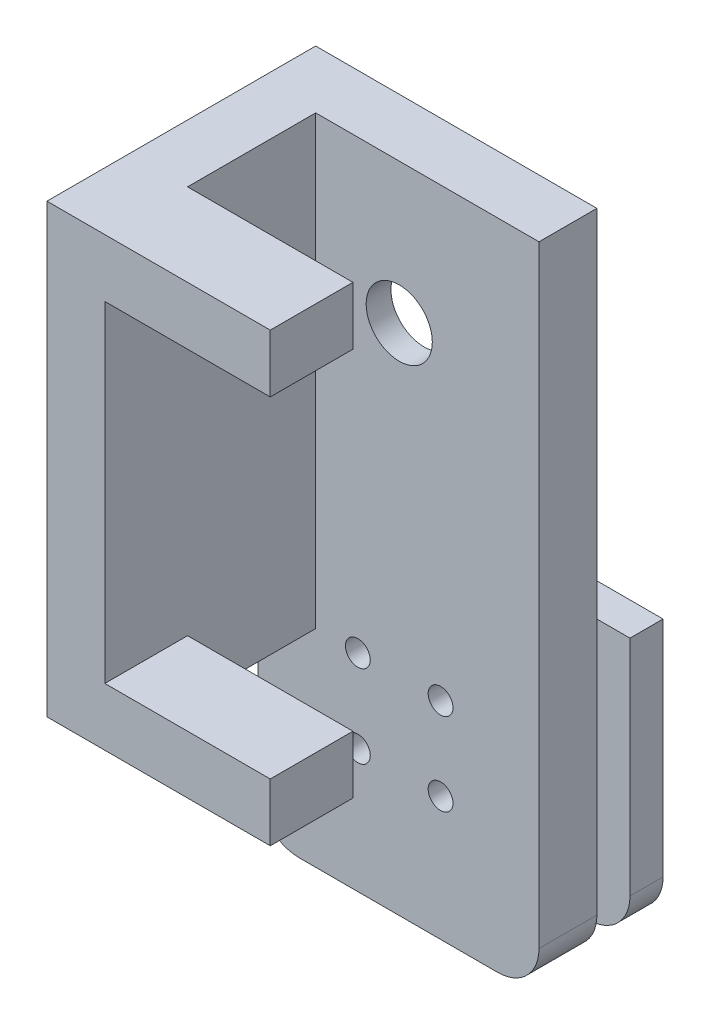
ISO-10303-21;
HEADER;
FILE_DESCRIPTION(('STEP AP214'),'2;1');
FILE_NAME('part.step','',(''),(''),'','','');
FILE_SCHEMA(('AUTOMOTIVE_DESIGN { 1 0 10303 214 1 1 1 1 }'));
ENDSEC;
DATA;
#1=APPLICATION_CONTEXT('core data for automotive mechanical design processes');
#2=APPLICATION_PROTOCOL_DEFINITION('international standard','automotive_design',2000,#1);
#3=PRODUCT_CONTEXT('',#1,'mechanical');
#4=PRODUCT('Part','Part','',(#3));
#5=PRODUCT_RELATED_PRODUCT_CATEGORY('part','',(#4));
#6=PRODUCT_DEFINITION_FORMATION('','',#4);
#7=PRODUCT_DEFINITION_CONTEXT('part definition',#1,'design');
#8=PRODUCT_DEFINITION('design','',#6,#7);
#9=PRODUCT_DEFINITION_SHAPE('','',#8);
#10=(LENGTH_UNIT() NAMED_UNIT(*) SI_UNIT(.MILLI.,.METRE.));
#11=(NAMED_UNIT(*) PLANE_ANGLE_UNIT() SI_UNIT($,.RADIAN.));
#12=(NAMED_UNIT(*) SI_UNIT($,.STERADIAN.) SOLID_ANGLE_UNIT());
#13=UNCERTAINTY_MEASURE_WITH_UNIT(LENGTH_MEASURE(1.E-05),#10,'distance_accuracy_value','');
#14=(GEOMETRIC_REPRESENTATION_CONTEXT(3) GLOBAL_UNCERTAINTY_ASSIGNED_CONTEXT((#13)) GLOBAL_UNIT_ASSIGNED_CONTEXT((#10,
#11,#12)) REPRESENTATION_CONTEXT('',''));
#15=CARTESIAN_POINT('',(0.,0.,0.));
#16=DIRECTION('',(0.,0.,1.));
#17=DIRECTION('',(1.,0.,0.));
#18=AXIS2_PLACEMENT_3D('',#15,#16,#17);
#19=CARTESIAN_POINT('',(0.,0.,10.));
#20=DIRECTION('',(0.,1.,0.));
#21=DIRECTION('',(0.,0.,1.));
#22=AXIS2_PLACEMENT_3D('',#19,#20,#21);
#23=PLANE('',#22);
#24=DIRECTION('',(-1.,0.,0.));
#25=VECTOR('',#24,1.);
#26=CARTESIAN_POINT('',(34.,0.,-15.494));
#27=LINE('',#26,#25);
#28=CARTESIAN_POINT('',(7.,0.,-15.494));
#29=VERTEX_POINT('',#28);
#30=CARTESIAN_POINT('',(0.,0.,-15.494));
#31=VERTEX_POINT('',#30);
#32=EDGE_CURVE('E236',#29,#31,#27,.T.);
#33=ORIENTED_EDGE('',*,*,#32,.F.);
#34=DIRECTION('',(0.,0.,1.));
#35=VECTOR('',#34,1.);
#36=CARTESIAN_POINT('',(7.,0.,-15.494));
#37=LINE('',#36,#35);
#38=CARTESIAN_POINT('',(7.,0.,0.));
#39=VERTEX_POINT('',#38);
#40=EDGE_CURVE('E284',#29,#39,#37,.T.);
#41=ORIENTED_EDGE('',*,*,#40,.T.);
#42=DIRECTION('',(1.,0.,0.));
#43=VECTOR('',#42,1.);
#44=CARTESIAN_POINT('',(0.,0.,0.));
#45=LINE('',#44,#43);
#46=CARTESIAN_POINT('',(27.,0.,0.));
#47=VERTEX_POINT('',#46);
#48=EDGE_CURVE('E295',#39,#47,#45,.T.);
#49=ORIENTED_EDGE('',*,*,#48,.T.);
#50=DIRECTION('',(0.,0.,-1.));
#51=VECTOR('',#50,1.);
#52=CARTESIAN_POINT('',(27.,0.,10.));
#53=LINE('',#52,#51);
#54=CARTESIAN_POINT('',(27.,0.,10.));
#55=VERTEX_POINT('',#54);
#56=EDGE_CURVE('E362',#55,#47,#53,.T.);
#57=ORIENTED_EDGE('',*,*,#56,.F.);
#58=DIRECTION('',(1.,0.,0.));
#59=VECTOR('',#58,1.);
#60=CARTESIAN_POINT('',(0.,0.,10.));
#61=LINE('',#60,#59);
#62=CARTESIAN_POINT('',(0.,0.,10.));
#63=VERTEX_POINT('',#62);
#64=EDGE_CURVE('E300',#63,#55,#61,.T.);
#65=ORIENTED_EDGE('',*,*,#64,.F.);
#66=DIRECTION('',(0.,0.,-1.));
#67=VECTOR('',#66,1.);
#68=CARTESIAN_POINT('',(0.,0.,10.));
#69=LINE('',#68,#67);
#70=EDGE_CURVE('E366',#63,#31,#69,.T.);
#71=ORIENTED_EDGE('',*,*,#70,.T.);
#72=EDGE_LOOP('',(#33,#41,#49,#57,#65,#71));
#73=FACE_BOUND('',#72,.T.);
#74=ADVANCED_FACE('F38',(#73),#23,.F.);
#75=CARTESIAN_POINT('',(0.,0.,0.));
#76=DIRECTION('',(0.,0.,-1.));
#77=DIRECTION('',(-1.,0.,0.));
#78=AXIS2_PLACEMENT_3D('',#75,#76,#77);
#79=PLANE('',#78);
#80=DIRECTION('',(0.,-1.,0.));
#81=VECTOR('',#80,1.);
#82=CARTESIAN_POINT('',(7.,0.,0.));
#83=LINE('',#82,#81);
#84=CARTESIAN_POINT('',(7.,54.,0.));
#85=VERTEX_POINT('',#84);
#86=CARTESIAN_POINT('',(6.99999999999999,47.,0.));
#87=VERTEX_POINT('',#86);
#88=EDGE_CURVE('E276',#85,#87,#83,.T.);
#89=ORIENTED_EDGE('',*,*,#88,.F.);
#90=DIRECTION('',(-1.,0.,0.));
#91=VECTOR('',#90,1.);
#92=CARTESIAN_POINT('',(0.,54.,0.));
#93=LINE('',#92,#91);
#94=CARTESIAN_POINT('',(27.,54.,0.));
#95=VERTEX_POINT('',#94);
#96=EDGE_CURVE('E301',#95,#85,#93,.T.);
#97=ORIENTED_EDGE('',*,*,#96,.F.);
#98=DIRECTION('',(0.,1.,0.));
#99=VECTOR('',#98,1.);
#100=CARTESIAN_POINT('',(27.,54.,0.));
#101=LINE('',#100,#99);
#102=CARTESIAN_POINT('',(27.,47.,0.));
#103=VERTEX_POINT('',#102);
#104=EDGE_CURVE('E335',#103,#95,#101,.T.);
#105=ORIENTED_EDGE('',*,*,#104,.F.);
#106=DIRECTION('',(1.,0.,0.));
#107=VECTOR('',#106,1.);
#108=CARTESIAN_POINT('',(27.,47.,0.));
#109=LINE('',#108,#107);
#110=EDGE_CURVE('E332',#87,#103,#109,.T.);
#111=ORIENTED_EDGE('',*,*,#110,.F.);
#112=EDGE_LOOP('',(#89,#97,#105,#111));
#113=FACE_BOUND('',#112,.T.);
#114=ADVANCED_FACE('F554',(#113),#79,.T.);
#115=CARTESIAN_POINT('',(0.,0.,10.));
#116=DIRECTION('',(1.,0.,0.));
#117=DIRECTION('',(0.,0.,-1.));
#118=AXIS2_PLACEMENT_3D('',#115,#116,#117);
#119=PLANE('',#118);
#120=DIRECTION('',(0.,-1.,0.));
#121=VECTOR('',#120,1.);
#122=CARTESIAN_POINT('',(0.,41.928498393146,-30.494));
#123=LINE('',#122,#121);
#124=CARTESIAN_POINT('',(0.,6.99999999999999,-30.494));
#125=VERTEX_POINT('',#124);
#126=CARTESIAN_POINT('',(0.,-20.,-30.494));
#127=VERTEX_POINT('',#126);
#128=EDGE_CURVE('E217',#125,#127,#123,.T.);
#129=ORIENTED_EDGE('',*,*,#128,.T.);
#130=DIRECTION('',(0.,0.,-1.));
#131=VECTOR('',#130,1.);
#132=CARTESIAN_POINT('',(0.,-20.,-15.494));
#133=LINE('',#132,#131);
#134=CARTESIAN_POINT('',(0.,-20.,-15.494));
#135=VERTEX_POINT('',#134);
#136=EDGE_CURVE('E47',#127,#135,#133,.F.);
#137=ORIENTED_EDGE('',*,*,#136,.T.);
#138=DIRECTION('',(0.,1.,0.));
#139=VECTOR('',#138,1.);
#140=CARTESIAN_POINT('',(0.,-25.,-15.494));
#141=LINE('',#140,#139);
#142=EDGE_CURVE('E235',#135,#31,#141,.T.);
#143=ORIENTED_EDGE('',*,*,#142,.T.);
#144=ORIENTED_EDGE('',*,*,#70,.F.);
#145=DIRECTION('',(0.,-1.,0.));
#146=VECTOR('',#145,1.);
#147=CARTESIAN_POINT('',(0.,0.,10.));
#148=LINE('',#147,#146);
#149=CARTESIAN_POINT('',(0.,54.,10.));
#150=VERTEX_POINT('',#149);
#151=EDGE_CURVE('E296',#150,#63,#148,.T.);
#152=ORIENTED_EDGE('',*,*,#151,.F.);
#153=DIRECTION('',(0.,0.,-1.));
#154=VECTOR('',#153,1.);
#155=CARTESIAN_POINT('',(0.,54.,10.));
#156=LINE('',#155,#154);
#157=CARTESIAN_POINT('',(0.,54.,-22.494));
#158=VERTEX_POINT('',#157);
#159=EDGE_CURVE('E322',#150,#158,#156,.T.);
#160=ORIENTED_EDGE('',*,*,#159,.T.);
#161=DIRECTION('',(0.,-1.,0.));
#162=VECTOR('',#161,1.);
#163=CARTESIAN_POINT('',(0.,54.,-22.494));
#164=LINE('',#163,#162);
#165=CARTESIAN_POINT('',(0.,6.99999999999999,-22.494));
#166=VERTEX_POINT('',#165);
#167=EDGE_CURVE('E252',#158,#166,#164,.T.);
#168=ORIENTED_EDGE('',*,*,#167,.T.);
#169=DIRECTION('',(0.,0.,1.));
#170=VECTOR('',#169,1.);
#171=CARTESIAN_POINT('',(0.,6.99999999999999,-22.494));
#172=LINE('',#171,#170);
#173=EDGE_CURVE('E426',#125,#166,#172,.T.);
#174=ORIENTED_EDGE('',*,*,#173,.F.);
#175=EDGE_LOOP('',(#129,#137,#143,#144,#152,#160,#168,#174));
#176=FACE_BOUND('',#175,.T.);
#177=ADVANCED_FACE('F515',(#176),#119,.F.);
#178=CARTESIAN_POINT('',(27.,0.,10.));
#179=DIRECTION('',(-1.,0.,0.));
#180=DIRECTION('',(0.,-1.,0.));
#181=AXIS2_PLACEMENT_3D('',#178,#179,#180);
#182=PLANE('',#181);
#183=DIRECTION('',(0.,1.,0.));
#184=VECTOR('',#183,1.);
#185=CARTESIAN_POINT('',(27.,0.,0.));
#186=LINE('',#185,#184);
#187=CARTESIAN_POINT('',(27.,7.,0.));
#188=VERTEX_POINT('',#187);
#189=EDGE_CURVE('E325',#47,#188,#186,.T.);
#190=ORIENTED_EDGE('',*,*,#189,.T.);
#191=DIRECTION('',(0.,0.,-1.));
#192=VECTOR('',#191,1.);
#193=CARTESIAN_POINT('',(27.,7.,10.));
#194=LINE('',#193,#192);
#195=CARTESIAN_POINT('',(27.,7.,10.));
#196=VERTEX_POINT('',#195);
#197=EDGE_CURVE('E358',#196,#188,#194,.T.);
#198=ORIENTED_EDGE('',*,*,#197,.F.);
#199=DIRECTION('',(0.,1.,0.));
#200=VECTOR('',#199,1.);
#201=CARTESIAN_POINT('',(27.,0.,10.));
#202=LINE('',#201,#200);
#203=EDGE_CURVE('E304',#55,#196,#202,.T.);
#204=ORIENTED_EDGE('',*,*,#203,.F.);
#205=ORIENTED_EDGE('',*,*,#56,.T.);
#206=EDGE_LOOP('',(#190,#198,#204,#205));
#207=FACE_BOUND('',#206,.T.);
#208=ADVANCED_FACE('F573',(#207),#182,.F.);
#209=CARTESIAN_POINT('',(27.,7.,10.));
#210=DIRECTION('',(0.,-1.,0.));
#211=DIRECTION('',(1.,0.,0.));
#212=AXIS2_PLACEMENT_3D('',#209,#210,#211);
#213=PLANE('',#212);
#214=DIRECTION('',(-1.,0.,0.));
#215=VECTOR('',#214,1.);
#216=CARTESIAN_POINT('',(27.,7.,0.));
#217=LINE('',#216,#215);
#218=CARTESIAN_POINT('',(7.,6.99999999999999,0.));
#219=VERTEX_POINT('',#218);
#220=EDGE_CURVE('E328',#188,#219,#217,.T.);
#221=ORIENTED_EDGE('',*,*,#220,.T.);
#222=DIRECTION('',(0.,0.,-1.));
#223=VECTOR('',#222,1.);
#224=CARTESIAN_POINT('',(7.,6.99999999999999,10.));
#225=LINE('',#224,#223);
#226=CARTESIAN_POINT('',(7.,6.99999999999999,10.));
#227=VERTEX_POINT('',#226);
#228=EDGE_CURVE('E354',#227,#219,#225,.T.);
#229=ORIENTED_EDGE('',*,*,#228,.F.);
#230=DIRECTION('',(-1.,0.,0.));
#231=VECTOR('',#230,1.);
#232=CARTESIAN_POINT('',(27.,7.,10.));
#233=LINE('',#232,#231);
#234=EDGE_CURVE('E307',#196,#227,#233,.T.);
#235=ORIENTED_EDGE('',*,*,#234,.F.);
#236=ORIENTED_EDGE('',*,*,#197,.T.);
#237=EDGE_LOOP('',(#221,#229,#235,#236));
#238=FACE_BOUND('',#237,.T.);
#239=ADVANCED_FACE('F567',(#238),#213,.F.);
#240=CARTESIAN_POINT('',(7.,6.99999999999999,10.));
#241=DIRECTION('',(-1.,0.,0.));
#242=DIRECTION('',(0.,-1.,0.));
#243=AXIS2_PLACEMENT_3D('',#240,#241,#242);
#244=PLANE('',#243);
#245=ORIENTED_EDGE('',*,*,#228,.T.);
#246=EDGE_CURVE('E240',#219,#39,#83,.T.);
#247=ORIENTED_EDGE('',*,*,#246,.T.);
#248=ORIENTED_EDGE('',*,*,#40,.F.);
#249=DIRECTION('',(0.,-1.,0.));
#250=VECTOR('',#249,1.);
#251=CARTESIAN_POINT('',(7.,0.,-15.494));
#252=LINE('',#251,#250);
#253=CARTESIAN_POINT('',(7.,54.,-15.494));
#254=VERTEX_POINT('',#253);
#255=EDGE_CURVE('E280',#254,#29,#252,.T.);
#256=ORIENTED_EDGE('',*,*,#255,.F.);
#257=DIRECTION('',(0.,0.,1.));
#258=VECTOR('',#257,1.);
#259=CARTESIAN_POINT('',(7.,54.,-15.494));
#260=LINE('',#259,#258);
#261=EDGE_CURVE('E291',#254,#85,#260,.T.);
#262=ORIENTED_EDGE('',*,*,#261,.T.);
#263=ORIENTED_EDGE('',*,*,#88,.T.);
#264=DIRECTION('',(0.,0.,-1.));
#265=VECTOR('',#264,1.);
#266=CARTESIAN_POINT('',(6.99999999999999,47.,10.));
#267=LINE('',#266,#265);
#268=CARTESIAN_POINT('',(6.99999999999999,47.,10.));
#269=VERTEX_POINT('',#268);
#270=EDGE_CURVE('E351',#269,#87,#267,.T.);
#271=ORIENTED_EDGE('',*,*,#270,.F.);
#272=DIRECTION('',(0.,1.,0.));
#273=VECTOR('',#272,1.);
#274=CARTESIAN_POINT('',(7.,6.99999999999999,10.));
#275=LINE('',#274,#273);
#276=EDGE_CURVE('E310',#227,#269,#275,.T.);
#277=ORIENTED_EDGE('',*,*,#276,.F.);
#278=EDGE_LOOP('',(#245,#247,#248,#256,#262,#263,#271,#277));
#279=FACE_BOUND('',#278,.T.);
#280=ADVANCED_FACE('F540',(#279),#244,.F.);
#281=CARTESIAN_POINT('',(27.,47.,10.));
#282=DIRECTION('',(0.,1.,0.));
#283=DIRECTION('',(0.,0.,1.));
#284=AXIS2_PLACEMENT_3D('',#281,#282,#283);
#285=PLANE('',#284);
#286=ORIENTED_EDGE('',*,*,#110,.T.);
#287=DIRECTION('',(0.,0.,-1.));
#288=VECTOR('',#287,1.);
#289=CARTESIAN_POINT('',(27.,47.,10.));
#290=LINE('',#289,#288);
#291=CARTESIAN_POINT('',(27.,47.,10.));
#292=VERTEX_POINT('',#291);
#293=EDGE_CURVE('E347',#292,#103,#290,.T.);
#294=ORIENTED_EDGE('',*,*,#293,.F.);
#295=DIRECTION('',(1.,0.,0.));
#296=VECTOR('',#295,1.);
#297=CARTESIAN_POINT('',(27.,47.,10.));
#298=LINE('',#297,#296);
#299=EDGE_CURVE('E313',#269,#292,#298,.T.);
#300=ORIENTED_EDGE('',*,*,#299,.F.);
#301=ORIENTED_EDGE('',*,*,#270,.T.);
#302=EDGE_LOOP('',(#286,#294,#300,#301));
#303=FACE_BOUND('',#302,.T.);
#304=ADVANCED_FACE('F561',(#303),#285,.F.);
#305=CARTESIAN_POINT('',(27.,54.,10.));
#306=DIRECTION('',(-1.,0.,0.));
#307=DIRECTION('',(0.,-1.,0.));
#308=AXIS2_PLACEMENT_3D('',#305,#306,#307);
#309=PLANE('',#308);
#310=ORIENTED_EDGE('',*,*,#104,.T.);
#311=DIRECTION('',(0.,0.,-1.));
#312=VECTOR('',#311,1.);
#313=CARTESIAN_POINT('',(27.,54.,10.));
#314=LINE('',#313,#312);
#315=CARTESIAN_POINT('',(27.,54.,10.));
#316=VERTEX_POINT('',#315);
#317=EDGE_CURVE('E343',#316,#95,#314,.T.);
#318=ORIENTED_EDGE('',*,*,#317,.F.);
#319=DIRECTION('',(0.,1.,0.));
#320=VECTOR('',#319,1.);
#321=CARTESIAN_POINT('',(27.,54.,10.));
#322=LINE('',#321,#320);
#323=EDGE_CURVE('E316',#292,#316,#322,.T.);
#324=ORIENTED_EDGE('',*,*,#323,.F.);
#325=ORIENTED_EDGE('',*,*,#293,.T.);
#326=EDGE_LOOP('',(#310,#318,#324,#325));
#327=FACE_BOUND('',#326,.T.);
#328=ADVANCED_FACE('F813',(#327),#309,.F.);
#329=CARTESIAN_POINT('',(0.,54.,10.));
#330=DIRECTION('',(0.,-1.,0.));
#331=DIRECTION('',(1.,0.,0.));
#332=AXIS2_PLACEMENT_3D('',#329,#330,#331);
#333=PLANE('',#332);
#334=ORIENTED_EDGE('',*,*,#96,.T.);
#335=ORIENTED_EDGE('',*,*,#261,.F.);
#336=DIRECTION('',(-1.,0.,0.));
#337=VECTOR('',#336,1.);
#338=CARTESIAN_POINT('',(34.,54.,-15.494));
#339=LINE('',#338,#337);
#340=CARTESIAN_POINT('',(34.,54.,-15.494));
#341=VERTEX_POINT('',#340);
#342=EDGE_CURVE('E268',#341,#254,#339,.T.);
#343=ORIENTED_EDGE('',*,*,#342,.F.);
#344=DIRECTION('',(0.,0.,-1.));
#345=VECTOR('',#344,1.);
#346=CARTESIAN_POINT('',(34.,54.,-15.494));
#347=LINE('',#346,#345);
#348=CARTESIAN_POINT('',(34.,54.,-22.494));
#349=VERTEX_POINT('',#348);
#350=EDGE_CURVE('E264',#341,#349,#347,.T.);
#351=ORIENTED_EDGE('',*,*,#350,.T.);
#352=DIRECTION('',(-1.,0.,0.));
#353=VECTOR('',#352,1.);
#354=CARTESIAN_POINT('',(34.,54.,-22.494));
#355=LINE('',#354,#353);
#356=EDGE_CURVE('E272',#349,#158,#355,.T.);
#357=ORIENTED_EDGE('',*,*,#356,.T.);
#358=ORIENTED_EDGE('',*,*,#159,.F.);
#359=DIRECTION('',(-1.,0.,0.));
#360=VECTOR('',#359,1.);
#361=CARTESIAN_POINT('',(0.,54.,10.));
#362=LINE('',#361,#360);
#363=EDGE_CURVE('E319',#316,#150,#362,.T.);
#364=ORIENTED_EDGE('',*,*,#363,.F.);
#365=ORIENTED_EDGE('',*,*,#317,.T.);
#366=EDGE_LOOP('',(#334,#335,#343,#351,#357,#358,#364,#365));
#367=FACE_BOUND('',#366,.T.);
#368=ADVANCED_FACE('F534',(#367),#333,.F.);
#369=CARTESIAN_POINT('',(0.,0.,10.));
#370=DIRECTION('',(0.,0.,-1.));
#371=DIRECTION('',(-1.,0.,0.));
#372=AXIS2_PLACEMENT_3D('',#369,#370,#371);
#373=PLANE('',#372);
#374=ORIENTED_EDGE('',*,*,#151,.T.);
#375=ORIENTED_EDGE('',*,*,#64,.T.);
#376=ORIENTED_EDGE('',*,*,#203,.T.);
#377=ORIENTED_EDGE('',*,*,#234,.T.);
#378=ORIENTED_EDGE('',*,*,#276,.T.);
#379=ORIENTED_EDGE('',*,*,#299,.T.);
#380=ORIENTED_EDGE('',*,*,#323,.T.);
#381=ORIENTED_EDGE('',*,*,#363,.T.);
#382=EDGE_LOOP('',(#374,#375,#376,#377,#378,#379,#380,#381));
#383=FACE_BOUND('',#382,.T.);
#384=ADVANCED_FACE('F546',(#383),#373,.F.);
#385=ORIENTED_EDGE('',*,*,#246,.F.);
#386=ORIENTED_EDGE('',*,*,#220,.F.);
#387=ORIENTED_EDGE('',*,*,#189,.F.);
#388=ORIENTED_EDGE('',*,*,#48,.F.);
#389=EDGE_LOOP('',(#385,#386,#387,#388));
#390=FACE_BOUND('',#389,.T.);
#391=ADVANCED_FACE('F571',(#390),#79,.T.);
#392=CARTESIAN_POINT('',(34.,54.,-22.494));
#393=DIRECTION('',(0.,0.,-1.));
#394=DIRECTION('',(0.,1.,0.));
#395=AXIS2_PLACEMENT_3D('',#392,#393,#394);
#396=PLANE('',#395);
#397=CARTESIAN_POINT('',(22.1,-10.,-22.494));
#398=DIRECTION('',(0.,0.,-1.));
#399=DIRECTION('',(0.,1.,0.));
#400=AXIS2_PLACEMENT_3D('',#397,#398,#399);
#401=CIRCLE('',#400,1.49999999999999);
#402=CARTESIAN_POINT('',(22.1,-8.50000000000001,-22.494));
#403=VERTEX_POINT('',#402);
#404=EDGE_CURVE('E389',#403,#403,#401,.T.);
#405=ORIENTED_EDGE('',*,*,#404,.F.);
#406=EDGE_LOOP('',(#405));
#407=FACE_BOUND('',#406,.T.);
#408=CARTESIAN_POINT('',(22.1,0.,-22.494));
#409=DIRECTION('',(0.,0.,-1.));
#410=DIRECTION('',(0.,1.,0.));
#411=AXIS2_PLACEMENT_3D('',#408,#409,#410);
#412=CIRCLE('',#411,1.49999999999999);
#413=CARTESIAN_POINT('',(22.1,1.49999999999999,-22.494));
#414=VERTEX_POINT('',#413);
#415=EDGE_CURVE('E379',#414,#414,#412,.T.);
#416=ORIENTED_EDGE('',*,*,#415,.F.);
#417=EDGE_LOOP('',(#416));
#418=FACE_BOUND('',#417,.T.);
#419=CARTESIAN_POINT('',(12.1,0.,-22.494));
#420=DIRECTION('',(0.,0.,-1.));
#421=DIRECTION('',(0.,1.,0.));
#422=AXIS2_PLACEMENT_3D('',#419,#420,#421);
#423=CIRCLE('',#422,1.49999999999999);
#424=CARTESIAN_POINT('',(12.1,1.49999999999999,-22.494));
#425=VERTEX_POINT('',#424);
#426=EDGE_CURVE('E462',#425,#425,#423,.T.);
#427=ORIENTED_EDGE('',*,*,#426,.F.);
#428=EDGE_LOOP('',(#427));
#429=FACE_BOUND('',#428,.T.);
#430=CARTESIAN_POINT('',(12.1,-10.,-22.494));
#431=DIRECTION('',(0.,0.,-1.));
#432=DIRECTION('',(0.,1.,0.));
#433=AXIS2_PLACEMENT_3D('',#430,#431,#432);
#434=CIRCLE('',#433,1.49999999999999);
#435=CARTESIAN_POINT('',(12.1,-8.50000000000001,-22.494));
#436=VERTEX_POINT('',#435);
#437=EDGE_CURVE('E451',#436,#436,#434,.T.);
#438=ORIENTED_EDGE('',*,*,#437,.F.);
#439=EDGE_LOOP('',(#438));
#440=FACE_BOUND('',#439,.T.);
#441=DIRECTION('',(0.,-1.,0.));
#442=VECTOR('',#441,1.);
#443=CARTESIAN_POINT('',(34.,54.,-22.494));
#444=LINE('',#443,#442);
#445=CARTESIAN_POINT('',(34.,-20.,-22.494));
#446=VERTEX_POINT('',#445);
#447=EDGE_CURVE('E257',#349,#446,#444,.T.);
#448=ORIENTED_EDGE('',*,*,#447,.T.);
#449=CARTESIAN_POINT('',(29.,-20.,-22.494));
#450=DIRECTION('',(0.,0.,-1.));
#451=DIRECTION('',(0.,1.,0.));
#452=AXIS2_PLACEMENT_3D('',#449,#450,#451);
#453=CIRCLE('',#452,5.);
#454=CARTESIAN_POINT('',(29.,-25.,-22.494));
#455=VERTEX_POINT('',#454);
#456=EDGE_CURVE('E403',#446,#455,#453,.T.);
#457=ORIENTED_EDGE('',*,*,#456,.T.);
#458=DIRECTION('',(1.,0.,0.));
#459=VECTOR('',#458,1.);
#460=CARTESIAN_POINT('',(34.,-25.,-22.494));
#461=LINE('',#460,#459);
#462=CARTESIAN_POINT('',(7.,-25.,-22.494));
#463=VERTEX_POINT('',#462);
#464=EDGE_CURVE('E232',#463,#455,#461,.T.);
#465=ORIENTED_EDGE('',*,*,#464,.F.);
#466=DIRECTION('',(0.,-1.,0.));
#467=VECTOR('',#466,1.);
#468=CARTESIAN_POINT('',(7.,41.928498393146,-22.494));
#469=LINE('',#468,#467);
#470=CARTESIAN_POINT('',(7.,6.99999999999999,-22.494));
#471=VERTEX_POINT('',#470);
#472=EDGE_CURVE('E204',#471,#463,#469,.T.);
#473=ORIENTED_EDGE('',*,*,#472,.F.);
#474=DIRECTION('',(1.,0.,0.));
#475=VECTOR('',#474,1.);
#476=CARTESIAN_POINT('',(7.00000000000001,6.99999999999999,-22.494));
#477=LINE('',#476,#475);
#478=EDGE_CURVE('E430',#166,#471,#477,.T.);
#479=ORIENTED_EDGE('',*,*,#478,.F.);
#480=ORIENTED_EDGE('',*,*,#167,.F.);
#481=ORIENTED_EDGE('',*,*,#356,.F.);
#482=EDGE_LOOP('',(#448,#457,#465,#473,#479,#480,#481));
#483=FACE_BOUND('',#482,.T.);
#484=CARTESIAN_POINT('',(17.1,37.04,-22.494));
#485=DIRECTION('',(0.,0.,-1.));
#486=DIRECTION('',(0.,1.,0.));
#487=AXIS2_PLACEMENT_3D('',#484,#485,#486);
#488=CIRCLE('',#487,11.);
#489=CARTESIAN_POINT('',(17.1,48.04,-22.494));
#490=VERTEX_POINT('',#489);
#491=EDGE_CURVE('E253',#490,#490,#488,.T.);
#492=ORIENTED_EDGE('',*,*,#491,.F.);
#493=EDGE_LOOP('',(#492));
#494=FACE_BOUND('',#493,.T.);
#495=ADVANCED_FACE('F619',(#407,#418,#429,#440,#483,#494),#396,.T.);
#496=CARTESIAN_POINT('',(34.,0.,-15.494));
#497=DIRECTION('',(0.,0.,1.));
#498=DIRECTION('',(0.,-1.,0.));
#499=AXIS2_PLACEMENT_3D('',#496,#497,#498);
#500=PLANE('',#499);
#501=CARTESIAN_POINT('',(22.1,-10.,-15.494));
#502=DIRECTION('',(0.,0.,1.));
#503=DIRECTION('',(0.,-1.,0.));
#504=AXIS2_PLACEMENT_3D('',#501,#502,#503);
#505=CIRCLE('',#504,1.49999999999999);
#506=CARTESIAN_POINT('',(22.1,-11.5,-15.494));
#507=VERTEX_POINT('',#506);
#508=EDGE_CURVE('E482',#507,#507,#505,.T.);
#509=ORIENTED_EDGE('',*,*,#508,.F.);
#510=EDGE_LOOP('',(#509));
#511=FACE_BOUND('',#510,.T.);
#512=CARTESIAN_POINT('',(22.1,0.,-15.494));
#513=DIRECTION('',(0.,0.,1.));
#514=DIRECTION('',(0.,-1.,0.));
#515=AXIS2_PLACEMENT_3D('',#512,#513,#514);
#516=CIRCLE('',#515,1.49999999999999);
#517=CARTESIAN_POINT('',(22.1,-1.5,-15.494));
#518=VERTEX_POINT('',#517);
#519=EDGE_CURVE('E383',#518,#518,#516,.T.);
#520=ORIENTED_EDGE('',*,*,#519,.F.);
#521=EDGE_LOOP('',(#520));
#522=FACE_BOUND('',#521,.T.);
#523=CARTESIAN_POINT('',(12.1,0.,-15.494));
#524=DIRECTION('',(0.,0.,1.));
#525=DIRECTION('',(0.,-1.,0.));
#526=AXIS2_PLACEMENT_3D('',#523,#524,#525);
#527=CIRCLE('',#526,1.49999999999999);
#528=CARTESIAN_POINT('',(12.1,-1.5,-15.494));
#529=VERTEX_POINT('',#528);
#530=EDGE_CURVE('E377',#529,#529,#527,.T.);
#531=ORIENTED_EDGE('',*,*,#530,.F.);
#532=EDGE_LOOP('',(#531));
#533=FACE_BOUND('',#532,.T.);
#534=CARTESIAN_POINT('',(12.1,-10.,-15.494));
#535=DIRECTION('',(0.,0.,1.));
#536=DIRECTION('',(0.,-1.,0.));
#537=AXIS2_PLACEMENT_3D('',#534,#535,#536);
#538=CIRCLE('',#537,1.49999999999999);
#539=CARTESIAN_POINT('',(12.1,-11.5,-15.494));
#540=VERTEX_POINT('',#539);
#541=EDGE_CURVE('E441',#540,#540,#538,.T.);
#542=ORIENTED_EDGE('',*,*,#541,.F.);
#543=EDGE_LOOP('',(#542));
#544=FACE_BOUND('',#543,.T.);
#545=CARTESIAN_POINT('',(17.1,37.04,-15.494));
#546=DIRECTION('',(0.,0.,1.));
#547=DIRECTION('',(0.,-1.,0.));
#548=AXIS2_PLACEMENT_3D('',#545,#546,#547);
#549=CIRCLE('',#548,4.);
#550=CARTESIAN_POINT('',(17.1,33.0399999999999,-15.494));
#551=VERTEX_POINT('',#550);
#552=EDGE_CURVE('E247',#551,#551,#549,.T.);
#553=ORIENTED_EDGE('',*,*,#552,.F.);
#554=EDGE_LOOP('',(#553));
#555=FACE_BOUND('',#554,.T.);
#556=ORIENTED_EDGE('',*,*,#142,.F.);
#557=CARTESIAN_POINT('',(5.,-20.,-15.494));
#558=DIRECTION('',(0.,0.,1.));
#559=DIRECTION('',(0.,-1.,0.));
#560=AXIS2_PLACEMENT_3D('',#557,#558,#559);
#561=CIRCLE('',#560,5.);
#562=CARTESIAN_POINT('',(5.,-25.,-15.494));
#563=VERTEX_POINT('',#562);
#564=EDGE_CURVE('E11',#135,#563,#561,.T.);
#565=ORIENTED_EDGE('',*,*,#564,.T.);
#566=DIRECTION('',(-1.,0.,0.));
#567=VECTOR('',#566,1.);
#568=CARTESIAN_POINT('',(34.,-25.,-15.494));
#569=LINE('',#568,#567);
#570=CARTESIAN_POINT('',(29.,-25.,-15.494));
#571=VERTEX_POINT('',#570);
#572=EDGE_CURVE('E228',#571,#563,#569,.T.);
#573=ORIENTED_EDGE('',*,*,#572,.F.);
#574=CARTESIAN_POINT('',(29.,-20.,-15.494));
#575=DIRECTION('',(0.,0.,1.));
#576=DIRECTION('',(0.,-1.,0.));
#577=AXIS2_PLACEMENT_3D('',#574,#575,#576);
#578=CIRCLE('',#577,5.);
#579=CARTESIAN_POINT('',(34.,-20.,-15.494));
#580=VERTEX_POINT('',#579);
#581=EDGE_CURVE('E397',#571,#580,#578,.T.);
#582=ORIENTED_EDGE('',*,*,#581,.T.);
#583=DIRECTION('',(0.,1.,0.));
#584=VECTOR('',#583,1.);
#585=CARTESIAN_POINT('',(34.,0.,-15.494));
#586=LINE('',#585,#584);
#587=EDGE_CURVE('E261',#580,#341,#586,.T.);
#588=ORIENTED_EDGE('',*,*,#587,.T.);
#589=ORIENTED_EDGE('',*,*,#342,.T.);
#590=ORIENTED_EDGE('',*,*,#255,.T.);
#591=ORIENTED_EDGE('',*,*,#32,.T.);
#592=EDGE_LOOP('',(#556,#565,#573,#582,#588,#589,#590,#591));
#593=FACE_BOUND('',#592,.T.);
#594=ADVANCED_FACE('F521',(#511,#522,#533,#544,#555,#593),#500,.T.);
#595=CARTESIAN_POINT('',(34.,0.,0.));
#596=DIRECTION('',(1.,0.,0.));
#597=DIRECTION('',(0.,0.,-1.));
#598=AXIS2_PLACEMENT_3D('',#595,#596,#597);
#599=PLANE('',#598);
#600=ORIENTED_EDGE('',*,*,#587,.F.);
#601=DIRECTION('',(0.,0.,1.));
#602=VECTOR('',#601,1.);
#603=CARTESIAN_POINT('',(34.,-20.,0.));
#604=LINE('',#603,#602);
#605=EDGE_CURVE('E400',#580,#446,#604,.F.);
#606=ORIENTED_EDGE('',*,*,#605,.T.);
#607=ORIENTED_EDGE('',*,*,#447,.F.);
#608=ORIENTED_EDGE('',*,*,#350,.F.);
#609=EDGE_LOOP('',(#600,#606,#607,#608));
#610=FACE_BOUND('',#609,.T.);
#611=ADVANCED_FACE('F531',(#610),#599,.T.);
#612=CARTESIAN_POINT('',(17.1,37.04,-18.494));
#613=DIRECTION('',(0.,0.,-1.));
#614=DIRECTION('',(0.,1.,0.));
#615=AXIS2_PLACEMENT_3D('',#612,#613,#614);
#616=CYLINDRICAL_SURFACE('',#615,11.);
#617=CARTESIAN_POINT('',(17.1,37.04,-18.494));
#618=DIRECTION('',(0.,0.,-1.));
#619=DIRECTION('',(0.,1.,0.));
#620=AXIS2_PLACEMENT_3D('',#617,#618,#619);
#621=CIRCLE('',#620,11.);
#622=CARTESIAN_POINT('',(17.1,48.04,-18.494));
#623=VERTEX_POINT('',#622);
#624=EDGE_CURVE('E248',#623,#623,#621,.T.);
#625=ORIENTED_EDGE('',*,*,#624,.F.);
#626=EDGE_LOOP('',(#625));
#627=FACE_BOUND('',#626,.T.);
#628=ORIENTED_EDGE('',*,*,#491,.T.);
#629=EDGE_LOOP('',(#628));
#630=FACE_BOUND('',#629,.T.);
#631=ADVANCED_FACE('F664',(#627,#630),#616,.F.);
#632=CARTESIAN_POINT('',(17.1,37.04,-18.494));
#633=DIRECTION('',(0.,0.,-1.));
#634=DIRECTION('',(0.,1.,0.));
#635=AXIS2_PLACEMENT_3D('',#632,#633,#634);
#636=PLANE('',#635);
#637=CARTESIAN_POINT('',(17.1,37.04,-18.494));
#638=DIRECTION('',(0.,0.,-1.));
#639=DIRECTION('',(0.,1.,0.));
#640=AXIS2_PLACEMENT_3D('',#637,#638,#639);
#641=CIRCLE('',#640,4.);
#642=CARTESIAN_POINT('',(17.1,41.04,-18.494));
#643=VERTEX_POINT('',#642);
#644=EDGE_CURVE('E243',#643,#643,#641,.T.);
#645=ORIENTED_EDGE('',*,*,#644,.F.);
#646=EDGE_LOOP('',(#645));
#647=FACE_BOUND('',#646,.T.);
#648=ORIENTED_EDGE('',*,*,#624,.T.);
#649=EDGE_LOOP('',(#648));
#650=FACE_BOUND('',#649,.T.);
#651=ADVANCED_FACE('F785',(#647,#650),#636,.T.);
#652=CARTESIAN_POINT('',(17.1,37.04,-8.494));
#653=DIRECTION('',(0.,0.,-1.));
#654=DIRECTION('',(0.,1.,0.));
#655=AXIS2_PLACEMENT_3D('',#652,#653,#654);
#656=CYLINDRICAL_SURFACE('',#655,4.);
#657=ORIENTED_EDGE('',*,*,#552,.T.);
#658=EDGE_LOOP('',(#657));
#659=FACE_BOUND('',#658,.T.);
#660=ORIENTED_EDGE('',*,*,#644,.T.);
#661=EDGE_LOOP('',(#660));
#662=FACE_BOUND('',#661,.T.);
#663=ADVANCED_FACE('F612',(#659,#662),#656,.F.);
#664=CARTESIAN_POINT('',(0.,-25.,0.));
#665=DIRECTION('',(0.,-1.,0.));
#666=DIRECTION('',(0.,0.,-1.));
#667=AXIS2_PLACEMENT_3D('',#664,#665,#666);
#668=PLANE('',#667);
#669=ORIENTED_EDGE('',*,*,#572,.T.);
#670=DIRECTION('',(0.,0.,-1.));
#671=VECTOR('',#670,1.);
#672=CARTESIAN_POINT('',(5.,-25.,-30.494));
#673=LINE('',#672,#671);
#674=CARTESIAN_POINT('',(5.,-25.,-30.494));
#675=VERTEX_POINT('',#674);
#676=EDGE_CURVE('E416',#563,#675,#673,.T.);
#677=ORIENTED_EDGE('',*,*,#676,.T.);
#678=DIRECTION('',(1.,0.,0.));
#679=VECTOR('',#678,1.);
#680=CARTESIAN_POINT('',(0.,-25.,-30.494));
#681=LINE('',#680,#679);
#682=CARTESIAN_POINT('',(29.,-25.,-30.494));
#683=VERTEX_POINT('',#682);
#684=EDGE_CURVE('E193',#675,#683,#681,.T.);
#685=ORIENTED_EDGE('',*,*,#684,.T.);
#686=DIRECTION('',(0.,0.,1.));
#687=VECTOR('',#686,1.);
#688=CARTESIAN_POINT('',(29.,-25.,0.));
#689=LINE('',#688,#687);
#690=CARTESIAN_POINT('',(29.,-25.,-26.494));
#691=VERTEX_POINT('',#690);
#692=EDGE_CURVE('E190',#683,#691,#689,.T.);
#693=ORIENTED_EDGE('',*,*,#692,.T.);
#694=DIRECTION('',(-1.,0.,0.));
#695=VECTOR('',#694,1.);
#696=CARTESIAN_POINT('',(34.,-25.,-26.494));
#697=LINE('',#696,#695);
#698=CARTESIAN_POINT('',(7.,-25.,-26.494));
#699=VERTEX_POINT('',#698);
#700=EDGE_CURVE('E182',#691,#699,#697,.T.);
#701=ORIENTED_EDGE('',*,*,#700,.T.);
#702=DIRECTION('',(0.,0.,1.));
#703=VECTOR('',#702,1.);
#704=CARTESIAN_POINT('',(7.,-25.,-26.494));
#705=LINE('',#704,#703);
#706=EDGE_CURVE('E188',#699,#463,#705,.T.);
#707=ORIENTED_EDGE('',*,*,#706,.T.);
#708=ORIENTED_EDGE('',*,*,#464,.T.);
#709=DIRECTION('',(0.,0.,1.));
#710=VECTOR('',#709,1.);
#711=CARTESIAN_POINT('',(29.,-25.,0.));
#712=LINE('',#711,#710);
#713=EDGE_CURVE('E393',#455,#571,#712,.T.);
#714=ORIENTED_EDGE('',*,*,#713,.T.);
#715=EDGE_LOOP('',(#669,#677,#685,#693,#701,#707,#708,#714));
#716=FACE_BOUND('',#715,.T.);
#717=ADVANCED_FACE('F185',(#716),#668,.T.);
#718=CARTESIAN_POINT('',(0.,41.928498393146,-30.494));
#719=DIRECTION('',(0.,0.,-1.));
#720=DIRECTION('',(-1.,0.,0.));
#721=AXIS2_PLACEMENT_3D('',#718,#719,#720);
#722=PLANE('',#721);
#723=CARTESIAN_POINT('',(22.1,-10.,-30.494));
#724=DIRECTION('',(0.,0.,-1.));
#725=DIRECTION('',(-1.,0.,0.));
#726=AXIS2_PLACEMENT_3D('',#723,#724,#725);
#727=CIRCLE('',#726,1.49999999999999);
#728=CARTESIAN_POINT('',(20.6,-10.,-30.494));
#729=VERTEX_POINT('',#728);
#730=EDGE_CURVE('E390',#729,#729,#727,.T.);
#731=ORIENTED_EDGE('',*,*,#730,.F.);
#732=EDGE_LOOP('',(#731));
#733=FACE_BOUND('',#732,.T.);
#734=CARTESIAN_POINT('',(22.1,0.,-30.494));
#735=DIRECTION('',(0.,0.,-1.));
#736=DIRECTION('',(-1.,0.,0.));
#737=AXIS2_PLACEMENT_3D('',#734,#735,#736);
#738=CIRCLE('',#737,1.49999999999999);
#739=CARTESIAN_POINT('',(20.6,0.,-30.494));
#740=VERTEX_POINT('',#739);
#741=EDGE_CURVE('E384',#740,#740,#738,.T.);
#742=ORIENTED_EDGE('',*,*,#741,.F.);
#743=EDGE_LOOP('',(#742));
#744=FACE_BOUND('',#743,.T.);
#745=CARTESIAN_POINT('',(12.1,0.,-30.494));
#746=DIRECTION('',(0.,0.,-1.));
#747=DIRECTION('',(-1.,0.,0.));
#748=AXIS2_PLACEMENT_3D('',#745,#746,#747);
#749=CIRCLE('',#748,1.49999999999999);
#750=CARTESIAN_POINT('',(10.6,0.,-30.494));
#751=VERTEX_POINT('',#750);
#752=EDGE_CURVE('E378',#751,#751,#749,.T.);
#753=ORIENTED_EDGE('',*,*,#752,.F.);
#754=EDGE_LOOP('',(#753));
#755=FACE_BOUND('',#754,.T.);
#756=CARTESIAN_POINT('',(12.1,-10.,-30.494));
#757=DIRECTION('',(0.,0.,-1.));
#758=DIRECTION('',(-1.,0.,0.));
#759=AXIS2_PLACEMENT_3D('',#756,#757,#758);
#760=CIRCLE('',#759,1.49999999999999);
#761=CARTESIAN_POINT('',(10.6,-10.,-30.494));
#762=VERTEX_POINT('',#761);
#763=EDGE_CURVE('E456',#762,#762,#760,.T.);
#764=ORIENTED_EDGE('',*,*,#763,.F.);
#765=EDGE_LOOP('',(#764));
#766=FACE_BOUND('',#765,.T.);
#767=ORIENTED_EDGE('',*,*,#684,.F.);
#768=CARTESIAN_POINT('',(5.,-20.,-30.494));
#769=DIRECTION('',(0.,0.,-1.));
#770=DIRECTION('',(-1.,0.,0.));
#771=AXIS2_PLACEMENT_3D('',#768,#769,#770);
#772=CIRCLE('',#771,5.);
#773=EDGE_CURVE('E61',#675,#127,#772,.T.);
#774=ORIENTED_EDGE('',*,*,#773,.T.);
#775=ORIENTED_EDGE('',*,*,#128,.F.);
#776=DIRECTION('',(-1.,0.,0.));
#777=VECTOR('',#776,1.);
#778=CARTESIAN_POINT('',(0.,6.99999999999999,-30.494));
#779=LINE('',#778,#777);
#780=CARTESIAN_POINT('',(34.,7.,-30.494));
#781=VERTEX_POINT('',#780);
#782=EDGE_CURVE('E229',#781,#125,#779,.T.);
#783=ORIENTED_EDGE('',*,*,#782,.F.);
#784=DIRECTION('',(0.,-1.,0.));
#785=VECTOR('',#784,1.);
#786=CARTESIAN_POINT('',(34.,41.928498393146,-30.494));
#787=LINE('',#786,#785);
#788=CARTESIAN_POINT('',(34.,-20.,-30.494));
#789=VERTEX_POINT('',#788);
#790=EDGE_CURVE('E210',#781,#789,#787,.T.);
#791=ORIENTED_EDGE('',*,*,#790,.T.);
#792=CARTESIAN_POINT('',(29.,-20.,-30.494));
#793=DIRECTION('',(0.,0.,-1.));
#794=DIRECTION('',(-1.,0.,0.));
#795=AXIS2_PLACEMENT_3D('',#792,#793,#794);
#796=CIRCLE('',#795,5.);
#797=EDGE_CURVE('E412',#789,#683,#796,.T.);
#798=ORIENTED_EDGE('',*,*,#797,.T.);
#799=EDGE_LOOP('',(#767,#774,#775,#783,#791,#798));
#800=FACE_BOUND('',#799,.T.);
#801=ADVANCED_FACE('F495',(#733,#744,#755,#766,#800),#722,.T.);
#802=CARTESIAN_POINT('',(7.,41.928498393146,-26.494));
#803=DIRECTION('',(1.,0.,0.));
#804=DIRECTION('',(0.,0.,-1.));
#805=AXIS2_PLACEMENT_3D('',#802,#803,#804);
#806=PLANE('',#805);
#807=DIRECTION('',(0.,0.,-1.));
#808=VECTOR('',#807,1.);
#809=CARTESIAN_POINT('',(7.,6.99999999999999,-26.494));
#810=LINE('',#809,#808);
#811=CARTESIAN_POINT('',(7.,6.99999999999999,-26.494));
#812=VERTEX_POINT('',#811);
#813=EDGE_CURVE('E434',#471,#812,#810,.T.);
#814=ORIENTED_EDGE('',*,*,#813,.F.);
#815=ORIENTED_EDGE('',*,*,#472,.T.);
#816=ORIENTED_EDGE('',*,*,#706,.F.);
#817=DIRECTION('',(0.,-1.,0.));
#818=VECTOR('',#817,1.);
#819=CARTESIAN_POINT('',(7.,41.928498393146,-26.494));
#820=LINE('',#819,#818);
#821=EDGE_CURVE('E197',#812,#699,#820,.T.);
#822=ORIENTED_EDGE('',*,*,#821,.F.);
#823=EDGE_LOOP('',(#814,#815,#816,#822));
#824=FACE_BOUND('',#823,.T.);
#825=ADVANCED_FACE('F208',(#824),#806,.T.);
#826=CARTESIAN_POINT('',(34.,41.928498393146,-26.494));
#827=DIRECTION('',(0.,0.,1.));
#828=DIRECTION('',(1.,0.,0.));
#829=AXIS2_PLACEMENT_3D('',#826,#827,#828);
#830=PLANE('',#829);
#831=CARTESIAN_POINT('',(22.1,-10.,-26.494));
#832=DIRECTION('',(0.,0.,1.));
#833=DIRECTION('',(1.,0.,0.));
#834=AXIS2_PLACEMENT_3D('',#831,#832,#833);
#835=CIRCLE('',#834,1.49999999999999);
#836=CARTESIAN_POINT('',(23.6,-10.,-26.494));
#837=VERTEX_POINT('',#836);
#838=EDGE_CURVE('E385',#837,#837,#835,.T.);
#839=ORIENTED_EDGE('',*,*,#838,.F.);
#840=EDGE_LOOP('',(#839));
#841=FACE_BOUND('',#840,.T.);
#842=CARTESIAN_POINT('',(22.1,0.,-26.494));
#843=DIRECTION('',(0.,0.,1.));
#844=DIRECTION('',(1.,0.,0.));
#845=AXIS2_PLACEMENT_3D('',#842,#843,#844);
#846=CIRCLE('',#845,1.49999999999999);
#847=CARTESIAN_POINT('',(23.6,0.,-26.494));
#848=VERTEX_POINT('',#847);
#849=EDGE_CURVE('E472',#848,#848,#846,.T.);
#850=ORIENTED_EDGE('',*,*,#849,.F.);
#851=EDGE_LOOP('',(#850));
#852=FACE_BOUND('',#851,.T.);
#853=CARTESIAN_POINT('',(12.1,0.,-26.494));
#854=DIRECTION('',(0.,0.,1.));
#855=DIRECTION('',(1.,0.,0.));
#856=AXIS2_PLACEMENT_3D('',#853,#854,#855);
#857=CIRCLE('',#856,1.49999999999999);
#858=CARTESIAN_POINT('',(13.6,0.,-26.494));
#859=VERTEX_POINT('',#858);
#860=EDGE_CURVE('E373',#859,#859,#857,.T.);
#861=ORIENTED_EDGE('',*,*,#860,.F.);
#862=EDGE_LOOP('',(#861));
#863=FACE_BOUND('',#862,.T.);
#864=CARTESIAN_POINT('',(12.1,-10.,-26.494));
#865=DIRECTION('',(0.,0.,1.));
#866=DIRECTION('',(1.,0.,0.));
#867=AXIS2_PLACEMENT_3D('',#864,#865,#866);
#868=CIRCLE('',#867,1.49999999999999);
#869=CARTESIAN_POINT('',(13.6,-10.,-26.494));
#870=VERTEX_POINT('',#869);
#871=EDGE_CURVE('E446',#870,#870,#868,.T.);
#872=ORIENTED_EDGE('',*,*,#871,.F.);
#873=EDGE_LOOP('',(#872));
#874=FACE_BOUND('',#873,.T.);
#875=ORIENTED_EDGE('',*,*,#700,.F.);
#876=CARTESIAN_POINT('',(29.,-20.,-26.494));
#877=DIRECTION('',(0.,0.,1.));
#878=DIRECTION('',(1.,0.,0.));
#879=AXIS2_PLACEMENT_3D('',#876,#877,#878);
#880=CIRCLE('',#879,5.);
#881=CARTESIAN_POINT('',(34.,-20.,-26.494));
#882=VERTEX_POINT('',#881);
#883=EDGE_CURVE('E406',#691,#882,#880,.T.);
#884=ORIENTED_EDGE('',*,*,#883,.T.);
#885=DIRECTION('',(0.,-1.,0.));
#886=VECTOR('',#885,1.);
#887=CARTESIAN_POINT('',(34.,41.928498393146,-26.494));
#888=LINE('',#887,#886);
#889=CARTESIAN_POINT('',(34.,7.,-26.494));
#890=VERTEX_POINT('',#889);
#891=EDGE_CURVE('E205',#890,#882,#888,.T.);
#892=ORIENTED_EDGE('',*,*,#891,.F.);
#893=DIRECTION('',(1.,0.,0.));
#894=VECTOR('',#893,1.);
#895=CARTESIAN_POINT('',(34.,7.,-26.494));
#896=LINE('',#895,#894);
#897=EDGE_CURVE('E200',#812,#890,#896,.T.);
#898=ORIENTED_EDGE('',*,*,#897,.F.);
#899=ORIENTED_EDGE('',*,*,#821,.T.);
#900=EDGE_LOOP('',(#875,#884,#892,#898,#899));
#901=FACE_BOUND('',#900,.T.);
#902=ADVANCED_FACE('F198',(#841,#852,#863,#874,#901),#830,.T.);
#903=CARTESIAN_POINT('',(34.,41.928498393146,-30.494));
#904=DIRECTION('',(1.,0.,0.));
#905=DIRECTION('',(0.,0.,-1.));
#906=AXIS2_PLACEMENT_3D('',#903,#904,#905);
#907=PLANE('',#906);
#908=ORIENTED_EDGE('',*,*,#891,.T.);
#909=DIRECTION('',(0.,0.,1.));
#910=VECTOR('',#909,1.);
#911=CARTESIAN_POINT('',(34.,-20.,-30.494));
#912=LINE('',#911,#910);
#913=EDGE_CURVE('E409',#882,#789,#912,.F.);
#914=ORIENTED_EDGE('',*,*,#913,.T.);
#915=ORIENTED_EDGE('',*,*,#790,.F.);
#916=DIRECTION('',(0.,0.,-1.));
#917=VECTOR('',#916,1.);
#918=CARTESIAN_POINT('',(34.,7.,-30.494));
#919=LINE('',#918,#917);
#920=EDGE_CURVE('E225',#890,#781,#919,.T.);
#921=ORIENTED_EDGE('',*,*,#920,.F.);
#922=EDGE_LOOP('',(#908,#914,#915,#921));
#923=FACE_BOUND('',#922,.T.);
#924=ADVANCED_FACE('F512',(#923),#907,.T.);
#925=CARTESIAN_POINT('',(27.,7.,10.));
#926=DIRECTION('',(0.,-1.,0.));
#927=DIRECTION('',(1.,0.,0.));
#928=AXIS2_PLACEMENT_3D('',#925,#926,#927);
#929=PLANE('',#928);
#930=ORIENTED_EDGE('',*,*,#782,.T.);
#931=ORIENTED_EDGE('',*,*,#173,.T.);
#932=ORIENTED_EDGE('',*,*,#478,.T.);
#933=ORIENTED_EDGE('',*,*,#813,.T.);
#934=ORIENTED_EDGE('',*,*,#897,.T.);
#935=ORIENTED_EDGE('',*,*,#920,.T.);
#936=EDGE_LOOP('',(#930,#931,#932,#933,#934,#935));
#937=FACE_BOUND('',#936,.T.);
#938=ADVANCED_FACE('F513',(#937),#929,.F.);
#939=CARTESIAN_POINT('',(12.1,-10.,-30.494));
#940=DIRECTION('',(0.,0.,-1.));
#941=DIRECTION('',(-1.,0.,0.));
#942=AXIS2_PLACEMENT_3D('',#939,#940,#941);
#943=CYLINDRICAL_SURFACE('',#942,1.49999999999999);
#944=ORIENTED_EDGE('',*,*,#871,.T.);
#945=EDGE_LOOP('',(#944));
#946=FACE_BOUND('',#945,.T.);
#947=ORIENTED_EDGE('',*,*,#763,.T.);
#948=EDGE_LOOP('',(#947));
#949=FACE_BOUND('',#948,.T.);
#950=ADVANCED_FACE('F741',(#946,#949),#943,.F.);
#951=ORIENTED_EDGE('',*,*,#541,.T.);
#952=EDGE_LOOP('',(#951));
#953=FACE_BOUND('',#952,.T.);
#954=ORIENTED_EDGE('',*,*,#437,.T.);
#955=EDGE_LOOP('',(#954));
#956=FACE_BOUND('',#955,.T.);
#957=ADVANCED_FACE('F732',(#953,#956),#943,.F.);
#958=CARTESIAN_POINT('',(12.1,0.,-30.494));
#959=DIRECTION('',(0.,0.,-1.));
#960=DIRECTION('',(-1.,0.,0.));
#961=AXIS2_PLACEMENT_3D('',#958,#959,#960);
#962=CYLINDRICAL_SURFACE('',#961,1.49999999999999);
#963=ORIENTED_EDGE('',*,*,#860,.T.);
#964=EDGE_LOOP('',(#963));
#965=FACE_BOUND('',#964,.T.);
#966=ORIENTED_EDGE('',*,*,#752,.T.);
#967=EDGE_LOOP('',(#966));
#968=FACE_BOUND('',#967,.T.);
#969=ADVANCED_FACE('F722',(#965,#968),#962,.F.);
#970=ORIENTED_EDGE('',*,*,#426,.T.);
#971=EDGE_LOOP('',(#970));
#972=FACE_BOUND('',#971,.T.);
#973=ORIENTED_EDGE('',*,*,#530,.T.);
#974=EDGE_LOOP('',(#973));
#975=FACE_BOUND('',#974,.T.);
#976=ADVANCED_FACE('F713',(#972,#975),#962,.F.);
#977=CARTESIAN_POINT('',(22.1,0.,-30.494));
#978=DIRECTION('',(0.,0.,-1.));
#979=DIRECTION('',(-1.,0.,0.));
#980=AXIS2_PLACEMENT_3D('',#977,#978,#979);
#981=CYLINDRICAL_SURFACE('',#980,1.49999999999999);
#982=ORIENTED_EDGE('',*,*,#519,.T.);
#983=EDGE_LOOP('',(#982));
#984=FACE_BOUND('',#983,.T.);
#985=ORIENTED_EDGE('',*,*,#415,.T.);
#986=EDGE_LOOP('',(#985));
#987=FACE_BOUND('',#986,.T.);
#988=ADVANCED_FACE('F703',(#984,#987),#981,.F.);
#989=ORIENTED_EDGE('',*,*,#849,.T.);
#990=EDGE_LOOP('',(#989));
#991=FACE_BOUND('',#990,.T.);
#992=ORIENTED_EDGE('',*,*,#741,.T.);
#993=EDGE_LOOP('',(#992));
#994=FACE_BOUND('',#993,.T.);
#995=ADVANCED_FACE('F694',(#991,#994),#981,.F.);
#996=CARTESIAN_POINT('',(22.1,-10.,-30.494));
#997=DIRECTION('',(0.,0.,-1.));
#998=DIRECTION('',(-1.,0.,0.));
#999=AXIS2_PLACEMENT_3D('',#996,#997,#998);
#1000=CYLINDRICAL_SURFACE('',#999,1.49999999999999);
#1001=ORIENTED_EDGE('',*,*,#838,.T.);
#1002=EDGE_LOOP('',(#1001));
#1003=FACE_BOUND('',#1002,.T.);
#1004=ORIENTED_EDGE('',*,*,#730,.T.);
#1005=EDGE_LOOP('',(#1004));
#1006=FACE_BOUND('',#1005,.T.);
#1007=ADVANCED_FACE('F493',(#1003,#1006),#1000,.F.);
#1008=ORIENTED_EDGE('',*,*,#508,.T.);
#1009=EDGE_LOOP('',(#1008));
#1010=FACE_BOUND('',#1009,.T.);
#1011=ORIENTED_EDGE('',*,*,#404,.T.);
#1012=EDGE_LOOP('',(#1011));
#1013=FACE_BOUND('',#1012,.T.);
#1014=ADVANCED_FACE('F591',(#1010,#1013),#1000,.F.);
#1015=CARTESIAN_POINT('',(29.,-20.,0.));
#1016=DIRECTION('',(0.,0.,1.));
#1017=DIRECTION('',(1.,0.,0.));
#1018=AXIS2_PLACEMENT_3D('',#1015,#1016,#1017);
#1019=CYLINDRICAL_SURFACE('',#1018,5.);
#1020=ORIENTED_EDGE('',*,*,#456,.F.);
#1021=ORIENTED_EDGE('',*,*,#605,.F.);
#1022=ORIENTED_EDGE('',*,*,#581,.F.);
#1023=ORIENTED_EDGE('',*,*,#713,.F.);
#1024=EDGE_LOOP('',(#1020,#1021,#1022,#1023));
#1025=FACE_BOUND('',#1024,.T.);
#1026=ADVANCED_FACE('F525',(#1025),#1019,.T.);
#1027=CARTESIAN_POINT('',(29.,-20.,0.));
#1028=DIRECTION('',(0.,0.,1.));
#1029=DIRECTION('',(1.,0.,0.));
#1030=AXIS2_PLACEMENT_3D('',#1027,#1028,#1029);
#1031=CYLINDRICAL_SURFACE('',#1030,5.);
#1032=ORIENTED_EDGE('',*,*,#797,.F.);
#1033=ORIENTED_EDGE('',*,*,#913,.F.);
#1034=ORIENTED_EDGE('',*,*,#883,.F.);
#1035=ORIENTED_EDGE('',*,*,#692,.F.);
#1036=EDGE_LOOP('',(#1032,#1033,#1034,#1035));
#1037=FACE_BOUND('',#1036,.T.);
#1038=ADVANCED_FACE('F509',(#1037),#1031,.T.);
#1039=CARTESIAN_POINT('',(5.,-20.,0.));
#1040=DIRECTION('',(0.,0.,1.));
#1041=DIRECTION('',(1.,0.,0.));
#1042=AXIS2_PLACEMENT_3D('',#1039,#1040,#1041);
#1043=CYLINDRICAL_SURFACE('',#1042,5.);
#1044=ORIENTED_EDGE('',*,*,#564,.F.);
#1045=ORIENTED_EDGE('',*,*,#136,.F.);
#1046=ORIENTED_EDGE('',*,*,#773,.F.);
#1047=ORIENTED_EDGE('',*,*,#676,.F.);
#1048=EDGE_LOOP('',(#1044,#1045,#1046,#1047));
#1049=FACE_BOUND('',#1048,.T.);
#1050=ADVANCED_FACE('F40',(#1049),#1043,.T.);
#1051=CLOSED_SHELL('',(#74,#114,#177,#208,#239,#280,#304,#328,#368,#384,#391,#495,#594,#611,
#631,#651,#663,#717,#801,#825,#902,#924,#938,#950,#957,#969,#976,#988,#995,#1007,#1014,#1026,
#1038,#1050));
#1052=MANIFOLD_SOLID_BREP('B2',#1051);
#1053=ADVANCED_BREP_SHAPE_REPRESENTATION('',(#18,#1052),#14);
#1054=SHAPE_DEFINITION_REPRESENTATION(#9,#1053);
ENDSEC;
END-ISO-10303-21;
